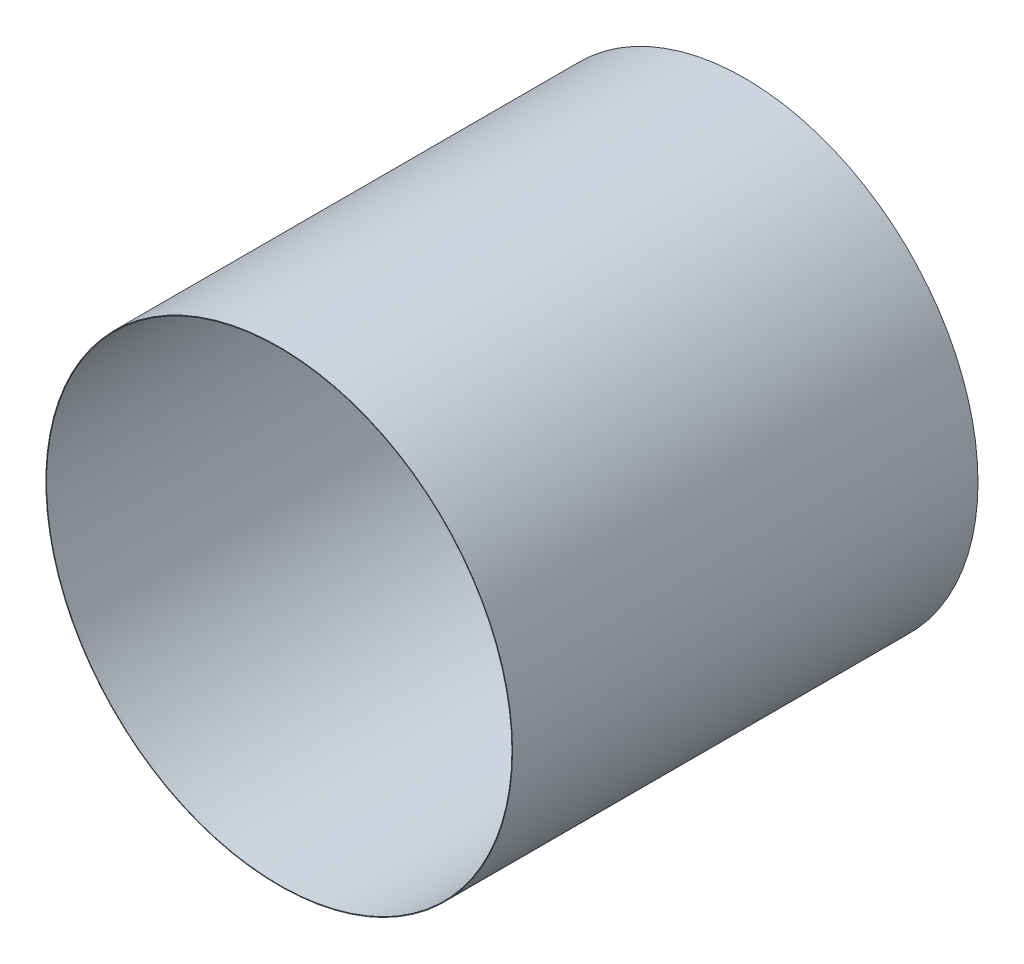
ISO-10303-21;
HEADER;
FILE_DESCRIPTION(('STEP AP214'),'2;1');
FILE_NAME('part.step','',(''),(''),'','','');
FILE_SCHEMA(('AUTOMOTIVE_DESIGN { 1 0 10303 214 1 1 1 1 }'));
ENDSEC;
DATA;
#1=APPLICATION_CONTEXT('core data for automotive mechanical design processes');
#2=APPLICATION_PROTOCOL_DEFINITION('international standard','automotive_design',2000,#1);
#3=PRODUCT_CONTEXT('',#1,'mechanical');
#4=PRODUCT('Part','Part','',(#3));
#5=PRODUCT_RELATED_PRODUCT_CATEGORY('part','',(#4));
#6=PRODUCT_DEFINITION_FORMATION('','',#4);
#7=PRODUCT_DEFINITION_CONTEXT('part definition',#1,'design');
#8=PRODUCT_DEFINITION('design','',#6,#7);
#9=PRODUCT_DEFINITION_SHAPE('','',#8);
#10=(LENGTH_UNIT() NAMED_UNIT(*) SI_UNIT(.MILLI.,.METRE.));
#11=(NAMED_UNIT(*) PLANE_ANGLE_UNIT() SI_UNIT($,.RADIAN.));
#12=(NAMED_UNIT(*) SI_UNIT($,.STERADIAN.) SOLID_ANGLE_UNIT());
#13=UNCERTAINTY_MEASURE_WITH_UNIT(LENGTH_MEASURE(1.E-05),#10,'distance_accuracy_value','');
#14=(GEOMETRIC_REPRESENTATION_CONTEXT(3) GLOBAL_UNCERTAINTY_ASSIGNED_CONTEXT((#13)) GLOBAL_UNIT_ASSIGNED_CONTEXT((#10,
#11,#12)) REPRESENTATION_CONTEXT('',''));
#15=CARTESIAN_POINT('',(0.,0.,0.));
#16=DIRECTION('',(0.,0.,1.));
#17=DIRECTION('',(1.,0.,0.));
#18=AXIS2_PLACEMENT_3D('',#15,#16,#17);
#19=CARTESIAN_POINT('',(0.,0.,150.));
#20=DIRECTION('',(0.,0.,1.));
#21=DIRECTION('',(1.,0.,0.));
#22=AXIS2_PLACEMENT_3D('',#19,#20,#21);
#23=PLANE('',#22);
#24=CARTESIAN_POINT('',(0.,0.,150.));
#25=DIRECTION('',(0.,0.,1.));
#26=DIRECTION('',(1.,0.,0.));
#27=AXIS2_PLACEMENT_3D('',#24,#25,#26);
#28=CIRCLE('',#27,75.2);
#29=CARTESIAN_POINT('',(75.2,0.,150.));
#30=VERTEX_POINT('',#29);
#31=EDGE_CURVE('E10',#30,#30,#28,.T.);
#32=ORIENTED_EDGE('',*,*,#31,.T.);
#33=EDGE_LOOP('',(#32));
#34=FACE_BOUND('',#33,.T.);
#35=CARTESIAN_POINT('',(0.,0.,150.));
#36=DIRECTION('',(0.,0.,1.));
#37=DIRECTION('',(1.,0.,0.));
#38=AXIS2_PLACEMENT_3D('',#35,#36,#37);
#39=CIRCLE('',#38,75.);
#40=CARTESIAN_POINT('',(75.,0.,150.));
#41=VERTEX_POINT('',#40);
#42=EDGE_CURVE('E46',#41,#41,#39,.T.);
#43=ORIENTED_EDGE('',*,*,#42,.F.);
#44=EDGE_LOOP('',(#43));
#45=FACE_BOUND('',#44,.T.);
#46=ADVANCED_FACE('F35',(#34,#45),#23,.T.);
#47=CARTESIAN_POINT('',(0.,0.,0.));
#48=DIRECTION('',(0.,0.,1.));
#49=DIRECTION('',(1.,0.,0.));
#50=AXIS2_PLACEMENT_3D('',#47,#48,#49);
#51=PLANE('',#50);
#52=CARTESIAN_POINT('',(0.,0.,0.));
#53=DIRECTION('',(0.,0.,1.));
#54=DIRECTION('',(1.,0.,0.));
#55=AXIS2_PLACEMENT_3D('',#52,#53,#54);
#56=CIRCLE('',#55,75.2);
#57=CARTESIAN_POINT('',(75.2,0.,0.));
#58=VERTEX_POINT('',#57);
#59=EDGE_CURVE('E39',#58,#58,#56,.T.);
#60=ORIENTED_EDGE('',*,*,#59,.F.);
#61=EDGE_LOOP('',(#60));
#62=FACE_BOUND('',#61,.T.);
#63=CARTESIAN_POINT('',(0.,0.,0.));
#64=DIRECTION('',(0.,0.,1.));
#65=DIRECTION('',(1.,0.,0.));
#66=AXIS2_PLACEMENT_3D('',#63,#64,#65);
#67=CIRCLE('',#66,75.);
#68=CARTESIAN_POINT('',(75.,0.,0.));
#69=VERTEX_POINT('',#68);
#70=EDGE_CURVE('E48',#69,#69,#67,.T.);
#71=ORIENTED_EDGE('',*,*,#70,.T.);
#72=EDGE_LOOP('',(#71));
#73=FACE_BOUND('',#72,.T.);
#74=ADVANCED_FACE('F58',(#62,#73),#51,.F.);
#75=CARTESIAN_POINT('',(0.,0.,150.));
#76=DIRECTION('',(0.,0.,-1.));
#77=DIRECTION('',(-1.,0.,0.));
#78=AXIS2_PLACEMENT_3D('',#75,#76,#77);
#79=CYLINDRICAL_SURFACE('',#78,75.2);
#80=ORIENTED_EDGE('',*,*,#31,.F.);
#81=EDGE_LOOP('',(#80));
#82=FACE_BOUND('',#81,.T.);
#83=ORIENTED_EDGE('',*,*,#59,.T.);
#84=EDGE_LOOP('',(#83));
#85=FACE_BOUND('',#84,.T.);
#86=ADVANCED_FACE('F37',(#82,#85),#79,.T.);
#87=CARTESIAN_POINT('',(0.,0.,150.));
#88=DIRECTION('',(0.,0.,-1.));
#89=DIRECTION('',(-1.,0.,0.));
#90=AXIS2_PLACEMENT_3D('',#87,#88,#89);
#91=CYLINDRICAL_SURFACE('',#90,75.);
#92=ORIENTED_EDGE('',*,*,#42,.T.);
#93=EDGE_LOOP('',(#92));
#94=FACE_BOUND('',#93,.T.);
#95=ORIENTED_EDGE('',*,*,#70,.F.);
#96=EDGE_LOOP('',(#95));
#97=FACE_BOUND('',#96,.T.);
#98=ADVANCED_FACE('F54',(#94,#97),#91,.F.);
#99=CLOSED_SHELL('',(#46,#74,#86,#98));
#100=MANIFOLD_SOLID_BREP('B2',#99);
#101=ADVANCED_BREP_SHAPE_REPRESENTATION('',(#18,#100),#14);
#102=SHAPE_DEFINITION_REPRESENTATION(#9,#101);
ENDSEC;
END-ISO-10303-21;
